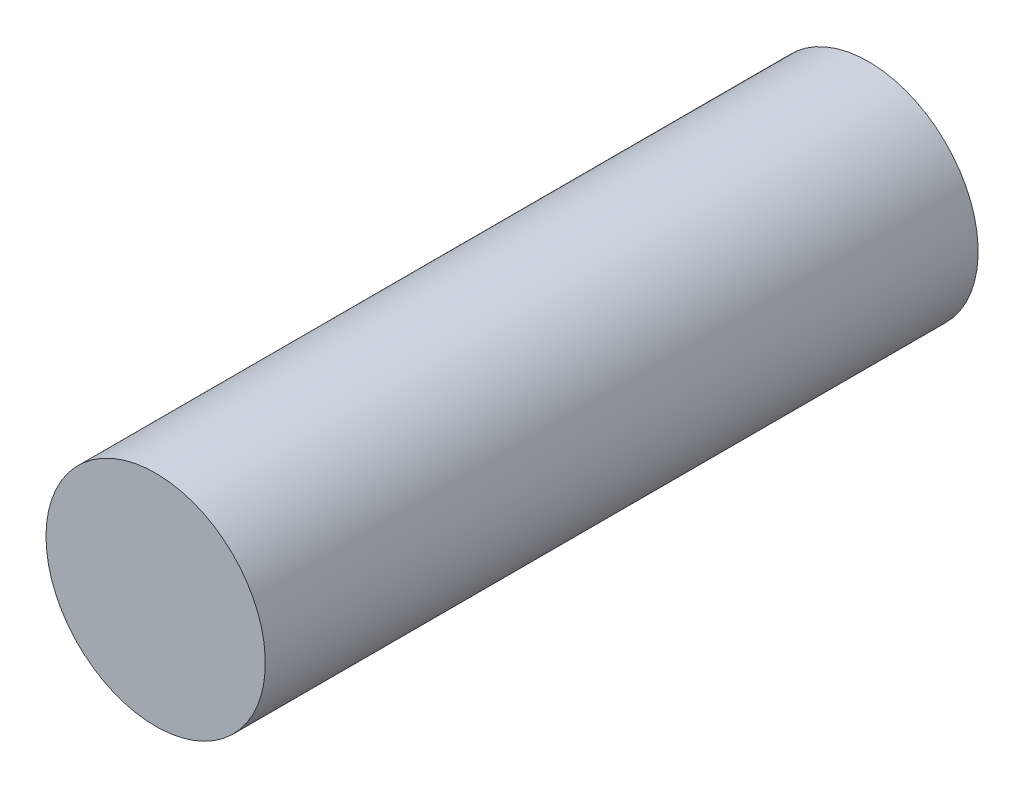
ISO-10303-21;
HEADER;
FILE_DESCRIPTION(('STEP AP214'),'2;1');
FILE_NAME('part.step','',(''),(''),'','','');
FILE_SCHEMA(('AUTOMOTIVE_DESIGN { 1 0 10303 214 1 1 1 1 }'));
ENDSEC;
DATA;
#1=APPLICATION_CONTEXT('core data for automotive mechanical design processes');
#2=APPLICATION_PROTOCOL_DEFINITION('international standard','automotive_design',2000,#1);
#3=PRODUCT_CONTEXT('',#1,'mechanical');
#4=PRODUCT('Part','Part','',(#3));
#5=PRODUCT_RELATED_PRODUCT_CATEGORY('part','',(#4));
#6=PRODUCT_DEFINITION_FORMATION('','',#4);
#7=PRODUCT_DEFINITION_CONTEXT('part definition',#1,'design');
#8=PRODUCT_DEFINITION('design','',#6,#7);
#9=PRODUCT_DEFINITION_SHAPE('','',#8);
#10=(LENGTH_UNIT() NAMED_UNIT(*) SI_UNIT(.MILLI.,.METRE.));
#11=(NAMED_UNIT(*) PLANE_ANGLE_UNIT() SI_UNIT($,.RADIAN.));
#12=(NAMED_UNIT(*) SI_UNIT($,.STERADIAN.) SOLID_ANGLE_UNIT());
#13=UNCERTAINTY_MEASURE_WITH_UNIT(LENGTH_MEASURE(1.E-05),#10,'distance_accuracy_value','');
#14=(GEOMETRIC_REPRESENTATION_CONTEXT(3) GLOBAL_UNCERTAINTY_ASSIGNED_CONTEXT((#13)) GLOBAL_UNIT_ASSIGNED_CONTEXT((#10,
#11,#12)) REPRESENTATION_CONTEXT('',''));
#15=CARTESIAN_POINT('',(0.,0.,0.));
#16=DIRECTION('',(0.,0.,1.));
#17=DIRECTION('',(1.,0.,0.));
#18=AXIS2_PLACEMENT_3D('',#15,#16,#17);
#19=CARTESIAN_POINT('',(0.,0.,26.));
#20=DIRECTION('',(0.,0.,-1.));
#21=DIRECTION('',(-1.,0.,0.));
#22=AXIS2_PLACEMENT_3D('',#19,#20,#21);
#23=CYLINDRICAL_SURFACE('',#22,8.);
#24=CARTESIAN_POINT('',(0.,0.,26.));
#25=DIRECTION('',(0.,0.,1.));
#26=DIRECTION('',(1.,0.,0.));
#27=AXIS2_PLACEMENT_3D('',#24,#25,#26);
#28=CIRCLE('',#27,8.);
#29=CARTESIAN_POINT('',(-8.,0.,26.));
#30=VERTEX_POINT('',#29);
#31=EDGE_CURVE('E10',#30,#30,#28,.T.);
#32=CARTESIAN_POINT('',(0.,0.,-26.));
#33=DIRECTION('',(0.,0.,1.));
#34=DIRECTION('',(1.,0.,0.));
#35=AXIS2_PLACEMENT_3D('',#32,#33,#34);
#36=CIRCLE('',#35,8.);
#37=CARTESIAN_POINT('',(-8.,0.,-26.));
#38=VERTEX_POINT('',#37);
#39=EDGE_CURVE('E38',#38,#38,#36,.T.);
#40=CARTESIAN_POINT('',(-8.,0.,26.));
#41=CARTESIAN_POINT('',(-8.,0.,25.4583333333333));
#42=CARTESIAN_POINT('',(-8.,0.,24.9166666666667));
#43=CARTESIAN_POINT('',(-8.,0.,23.8333333333333));
#44=CARTESIAN_POINT('',(-8.,0.,23.2916666666667));
#45=CARTESIAN_POINT('',(-8.,0.,22.2083333333333));
#46=CARTESIAN_POINT('',(-8.,0.,21.6666666666667));
#47=CARTESIAN_POINT('',(-8.,0.,20.5833333333333));
#48=CARTESIAN_POINT('',(-8.,0.,20.0416666666667));
#49=CARTESIAN_POINT('',(-8.,0.,18.9583333333333));
#50=CARTESIAN_POINT('',(-8.,0.,18.4166666666667));
#51=CARTESIAN_POINT('',(-8.,0.,17.3333333333333));
#52=CARTESIAN_POINT('',(-8.,0.,16.7916666666667));
#53=CARTESIAN_POINT('',(-8.,0.,15.7083333333333));
#54=CARTESIAN_POINT('',(-8.,0.,15.1666666666667));
#55=CARTESIAN_POINT('',(-8.,0.,14.0833333333333));
#56=CARTESIAN_POINT('',(-8.,0.,13.5416666666667));
#57=CARTESIAN_POINT('',(-8.,0.,12.4583333333333));
#58=CARTESIAN_POINT('',(-8.,0.,11.9166666666667));
#59=CARTESIAN_POINT('',(-8.,0.,10.8333333333333));
#60=CARTESIAN_POINT('',(-8.,0.,10.2916666666667));
#61=CARTESIAN_POINT('',(-8.,0.,9.20833333333333));
#62=CARTESIAN_POINT('',(-8.,0.,8.66666666666666));
#63=CARTESIAN_POINT('',(-8.,0.,7.58333333333333));
#64=CARTESIAN_POINT('',(-8.,0.,7.04166666666666));
#65=CARTESIAN_POINT('',(-8.,0.,5.95833333333333));
#66=CARTESIAN_POINT('',(-8.,0.,5.41666666666666));
#67=CARTESIAN_POINT('',(-8.,0.,4.33333333333333));
#68=CARTESIAN_POINT('',(-8.,0.,3.79166666666666));
#69=CARTESIAN_POINT('',(-8.,0.,2.70833333333333));
#70=CARTESIAN_POINT('',(-8.,0.,2.16666666666666));
#71=CARTESIAN_POINT('',(-8.,0.,1.08333333333333));
#72=CARTESIAN_POINT('',(-8.,0.,0.541666666666664));
#73=CARTESIAN_POINT('',(-8.,0.,-0.54166666666667));
#74=CARTESIAN_POINT('',(-8.,0.,-1.08333333333334));
#75=CARTESIAN_POINT('',(-8.,0.,-2.16666666666667));
#76=CARTESIAN_POINT('',(-8.,0.,-2.70833333333334));
#77=CARTESIAN_POINT('',(-8.,0.,-3.79166666666667));
#78=CARTESIAN_POINT('',(-8.,0.,-4.33333333333334));
#79=CARTESIAN_POINT('',(-8.,0.,-5.41666666666667));
#80=CARTESIAN_POINT('',(-8.,0.,-5.95833333333333));
#81=CARTESIAN_POINT('',(-8.,0.,-7.04166666666666));
#82=CARTESIAN_POINT('',(-8.,0.,-7.58333333333333));
#83=CARTESIAN_POINT('',(-8.,0.,-8.66666666666666));
#84=CARTESIAN_POINT('',(-8.,0.,-9.20833333333333));
#85=CARTESIAN_POINT('',(-8.,0.,-10.2916666666667));
#86=CARTESIAN_POINT('',(-8.,0.,-10.8333333333333));
#87=CARTESIAN_POINT('',(-8.,0.,-11.9166666666667));
#88=CARTESIAN_POINT('',(-8.,0.,-12.4583333333333));
#89=CARTESIAN_POINT('',(-8.,0.,-13.5416666666667));
#90=CARTESIAN_POINT('',(-8.,0.,-14.0833333333333));
#91=CARTESIAN_POINT('',(-8.,0.,-15.1666666666667));
#92=CARTESIAN_POINT('',(-8.,0.,-15.7083333333333));
#93=CARTESIAN_POINT('',(-8.,0.,-16.7916666666667));
#94=CARTESIAN_POINT('',(-8.,0.,-17.3333333333333));
#95=CARTESIAN_POINT('',(-8.,0.,-18.4166666666667));
#96=CARTESIAN_POINT('',(-8.,0.,-18.9583333333333));
#97=CARTESIAN_POINT('',(-8.,0.,-20.0416666666667));
#98=CARTESIAN_POINT('',(-8.,0.,-20.5833333333333));
#99=CARTESIAN_POINT('',(-8.,0.,-21.6666666666667));
#100=CARTESIAN_POINT('',(-8.,0.,-22.2083333333333));
#101=CARTESIAN_POINT('',(-8.,0.,-23.2916666666667));
#102=CARTESIAN_POINT('',(-8.,0.,-23.8333333333333));
#103=CARTESIAN_POINT('',(-8.,0.,-24.9166666666667));
#104=CARTESIAN_POINT('',(-8.,0.,-25.4583333333333));
#105=CARTESIAN_POINT('',(-8.,0.,-26.));
#106=B_SPLINE_CURVE_WITH_KNOTS('',3,(#40,#41,#42,#43,#44,#45,#46,#47,#48,#49,#50,#51,#52,#53,
#54,#55,#56,#57,#58,#59,#60,#61,#62,#63,#64,#65,#66,#67,#68,#69,#70,#71,#72,#73,#74,#75,#76,#77,
#78,#79,#80,#81,#82,#83,#84,#85,#86,#87,#88,#89,#90,#91,#92,#93,#94,#95,#96,#97,#98,#99,#100,
#101,#102,#103,#104,#105),.UNSPECIFIED.,.F.,.F.,(4,2,2,2,2,2,2,2,2,2,2,2,2,2,2,2,2,2,2,2,2,2,2,
2,2,2,2,2,2,2,2,2,4),(0.,1.625,3.25,4.875,6.5,8.125,9.75,11.375,13.,14.625,16.25,17.875,19.5,
21.125,22.75,24.375,26.,27.625,29.25,30.875,32.5,34.125,35.75,37.375,39.,40.625,42.25,43.875,
45.5,47.125,48.75,50.375,52.),.UNSPECIFIED.);
#107=EDGE_CURVE('BSEAM35',#30,#38,#106,.T.);
#108=ORIENTED_EDGE('',*,*,#31,.F.);
#109=ORIENTED_EDGE('',*,*,#39,.T.);
#110=ORIENTED_EDGE('',*,*,#107,.T.);
#111=ORIENTED_EDGE('',*,*,#107,.F.);
#112=EDGE_LOOP('',(#108,#110,#109,#111));
#113=FACE_BOUND('',#112,.T.);
#114=ADVANCED_FACE('F35',(#113),#23,.T.);
#115=CARTESIAN_POINT('',(0.,0.,26.));
#116=DIRECTION('',(0.,0.,1.));
#117=DIRECTION('',(1.,0.,0.));
#118=AXIS2_PLACEMENT_3D('',#115,#116,#117);
#119=PLANE('',#118);
#120=ORIENTED_EDGE('',*,*,#31,.T.);
#121=EDGE_LOOP('',(#120));
#122=FACE_BOUND('',#121,.T.);
#123=ADVANCED_FACE('F50',(#122),#119,.T.);
#124=CARTESIAN_POINT('',(0.,0.,-26.));
#125=DIRECTION('',(0.,0.,1.));
#126=DIRECTION('',(1.,0.,0.));
#127=AXIS2_PLACEMENT_3D('',#124,#125,#126);
#128=PLANE('',#127);
#129=ORIENTED_EDGE('',*,*,#39,.F.);
#130=EDGE_LOOP('',(#129));
#131=FACE_BOUND('',#130,.T.);
#132=ADVANCED_FACE('F48',(#131),#128,.F.);
#133=CLOSED_SHELL('',(#114,#123,#132));
#134=MANIFOLD_SOLID_BREP('B2',#133);
#135=ADVANCED_BREP_SHAPE_REPRESENTATION('',(#18,#134),#14);
#136=SHAPE_DEFINITION_REPRESENTATION(#9,#135);
ENDSEC;
END-ISO-10303-21;
